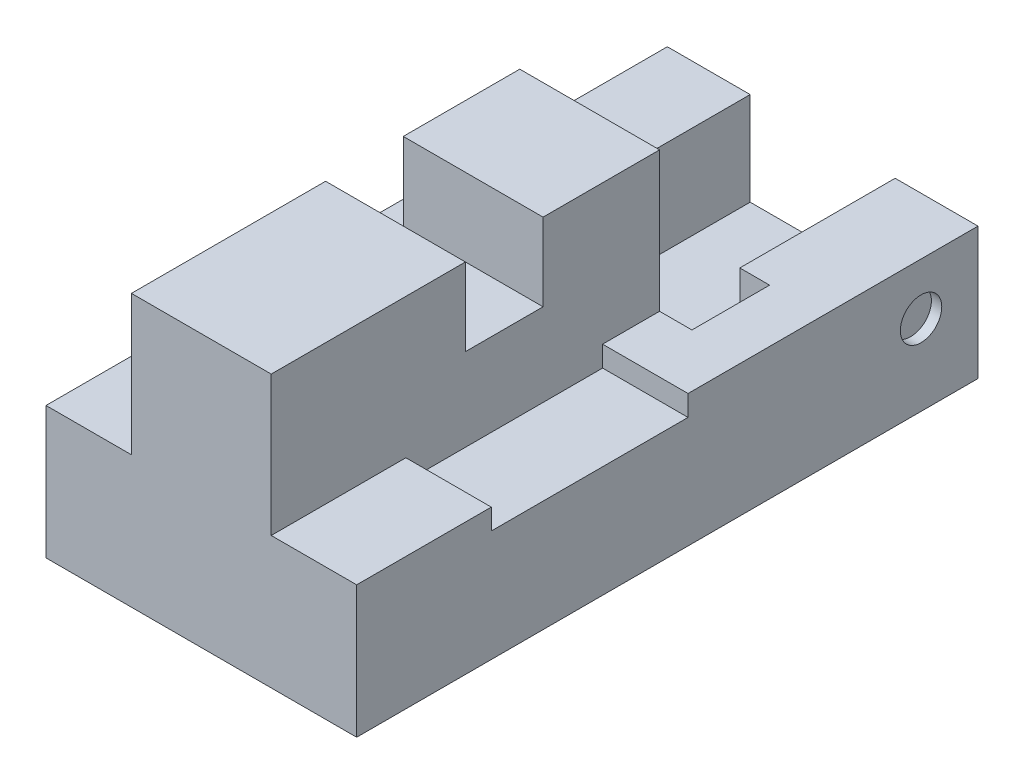
ISO-10303-21;
HEADER;
FILE_DESCRIPTION(('STEP AP214'),'2;1');
FILE_NAME('part.step','',(''),(''),'','','');
FILE_SCHEMA(('AUTOMOTIVE_DESIGN { 1 0 10303 214 1 1 1 1 }'));
ENDSEC;
DATA;
#1=APPLICATION_CONTEXT('core data for automotive mechanical design processes');
#2=APPLICATION_PROTOCOL_DEFINITION('international standard','automotive_design',2000,#1);
#3=PRODUCT_CONTEXT('',#1,'mechanical');
#4=PRODUCT('Part','Part','',(#3));
#5=PRODUCT_RELATED_PRODUCT_CATEGORY('part','',(#4));
#6=PRODUCT_DEFINITION_FORMATION('','',#4);
#7=PRODUCT_DEFINITION_CONTEXT('part definition',#1,'design');
#8=PRODUCT_DEFINITION('design','',#6,#7);
#9=PRODUCT_DEFINITION_SHAPE('','',#8);
#10=(LENGTH_UNIT() NAMED_UNIT(*) SI_UNIT(.MILLI.,.METRE.));
#11=(NAMED_UNIT(*) PLANE_ANGLE_UNIT() SI_UNIT($,.RADIAN.));
#12=(NAMED_UNIT(*) SI_UNIT($,.STERADIAN.) SOLID_ANGLE_UNIT());
#13=UNCERTAINTY_MEASURE_WITH_UNIT(LENGTH_MEASURE(1.E-05),#10,'distance_accuracy_value','');
#14=(GEOMETRIC_REPRESENTATION_CONTEXT(3) GLOBAL_UNCERTAINTY_ASSIGNED_CONTEXT((#13)) GLOBAL_UNIT_ASSIGNED_CONTEXT((#10,
#11,#12)) REPRESENTATION_CONTEXT('',''));
#15=CARTESIAN_POINT('',(0.,0.,0.));
#16=DIRECTION('',(0.,0.,1.));
#17=DIRECTION('',(1.,0.,0.));
#18=AXIS2_PLACEMENT_3D('',#15,#16,#17);
#19=CARTESIAN_POINT('',(0.,4.5,0.));
#20=DIRECTION('',(0.,1.,0.));
#21=DIRECTION('',(0.,0.,1.));
#22=AXIS2_PLACEMENT_3D('',#19,#20,#21);
#23=PLANE('',#22);
#24=DIRECTION('',(1.,0.,0.));
#25=VECTOR('',#24,1.);
#26=CARTESIAN_POINT('',(-1.35,4.5,5.25));
#27=LINE('',#26,#25);
#28=CARTESIAN_POINT('',(-1.35,4.5,5.25));
#29=VERTEX_POINT('',#28);
#30=CARTESIAN_POINT('',(1.35,4.5,5.25));
#31=VERTEX_POINT('',#30);
#32=EDGE_CURVE('E237',#29,#31,#27,.T.);
#33=ORIENTED_EDGE('',*,*,#32,.F.);
#34=DIRECTION('',(0.,0.,1.));
#35=VECTOR('',#34,1.);
#36=CARTESIAN_POINT('',(-1.35,4.5,2.6));
#37=LINE('',#36,#35);
#38=CARTESIAN_POINT('',(-1.35,4.5,9.));
#39=VERTEX_POINT('',#38);
#40=EDGE_CURVE('E271',#29,#39,#37,.T.);
#41=ORIENTED_EDGE('',*,*,#40,.T.);
#42=DIRECTION('',(1.,0.,0.));
#43=VECTOR('',#42,1.);
#44=CARTESIAN_POINT('',(-1.35,4.5,9.));
#45=LINE('',#44,#43);
#46=CARTESIAN_POINT('',(1.35,4.5,9.));
#47=VERTEX_POINT('',#46);
#48=EDGE_CURVE('E270',#39,#47,#45,.T.);
#49=ORIENTED_EDGE('',*,*,#48,.T.);
#50=DIRECTION('',(0.,0.,-1.));
#51=VECTOR('',#50,1.);
#52=CARTESIAN_POINT('',(1.35,4.5,6.4));
#53=LINE('',#52,#51);
#54=EDGE_CURVE('E274',#47,#31,#53,.T.);
#55=ORIENTED_EDGE('',*,*,#54,.T.);
#56=EDGE_LOOP('',(#33,#41,#49,#55));
#57=FACE_BOUND('',#56,.T.);
#58=ADVANCED_FACE('F44',(#57),#23,.T.);
#59=CARTESIAN_POINT('',(0.,1.8,0.));
#60=DIRECTION('',(0.,-1.,0.));
#61=DIRECTION('',(0.,0.,-1.));
#62=AXIS2_PLACEMENT_3D('',#59,#60,#61);
#63=PLANE('',#62);
#64=DIRECTION('',(0.,0.,1.));
#65=VECTOR('',#64,1.);
#66=CARTESIAN_POINT('',(-1.35,1.8,2.6));
#67=LINE('',#66,#65);
#68=CARTESIAN_POINT('',(-1.35,1.8,1.5));
#69=VERTEX_POINT('',#68);
#70=CARTESIAN_POINT('',(-1.35,1.8,2.6));
#71=VERTEX_POINT('',#70);
#72=EDGE_CURVE('E55',#69,#71,#67,.T.);
#73=ORIENTED_EDGE('',*,*,#72,.F.);
#74=DIRECTION('',(-1.,0.,0.));
#75=VECTOR('',#74,1.);
#76=CARTESIAN_POINT('',(-1.975,1.8,1.5));
#77=LINE('',#76,#75);
#78=CARTESIAN_POINT('',(-1.975,1.8,1.5));
#79=VERTEX_POINT('',#78);
#80=EDGE_CURVE('E396',#69,#79,#77,.T.);
#81=ORIENTED_EDGE('',*,*,#80,.T.);
#82=DIRECTION('',(0.,0.,-1.));
#83=VECTOR('',#82,1.);
#84=CARTESIAN_POINT('',(-1.975,1.8,0.));
#85=LINE('',#84,#83);
#86=CARTESIAN_POINT('',(-1.975,1.8,0.));
#87=VERTEX_POINT('',#86);
#88=EDGE_CURVE('E399',#79,#87,#85,.T.);
#89=ORIENTED_EDGE('',*,*,#88,.T.);
#90=DIRECTION('',(1.,0.,0.));
#91=VECTOR('',#90,1.);
#92=CARTESIAN_POINT('',(-1.4,1.8,0.));
#93=LINE('',#92,#91);
#94=CARTESIAN_POINT('',(-1.4,1.8,0.));
#95=VERTEX_POINT('',#94);
#96=EDGE_CURVE('E401',#87,#95,#93,.T.);
#97=ORIENTED_EDGE('',*,*,#96,.T.);
#98=DIRECTION('',(0.,0.,-1.));
#99=VECTOR('',#98,1.);
#100=CARTESIAN_POINT('',(-1.4,1.8,-3.));
#101=LINE('',#100,#99);
#102=CARTESIAN_POINT('',(-1.4,1.8,-3.));
#103=VERTEX_POINT('',#102);
#104=EDGE_CURVE('E403',#95,#103,#101,.T.);
#105=ORIENTED_EDGE('',*,*,#104,.T.);
#106=DIRECTION('',(-1.,0.,0.));
#107=VECTOR('',#106,1.);
#108=CARTESIAN_POINT('',(-3.,1.8,-3.));
#109=LINE('',#108,#107);
#110=CARTESIAN_POINT('',(-3.,1.8,-3.));
#111=VERTEX_POINT('',#110);
#112=EDGE_CURVE('E373',#103,#111,#109,.T.);
#113=ORIENTED_EDGE('',*,*,#112,.T.);
#114=DIRECTION('',(0.,0.,1.));
#115=VECTOR('',#114,1.);
#116=CARTESIAN_POINT('',(-3.,1.8,9.));
#117=LINE('',#116,#115);
#118=CARTESIAN_POINT('',(-3.,1.8,2.6));
#119=VERTEX_POINT('',#118);
#120=EDGE_CURVE('E378',#111,#119,#117,.T.);
#121=ORIENTED_EDGE('',*,*,#120,.T.);
#122=DIRECTION('',(-1.,0.,0.));
#123=VECTOR('',#122,1.);
#124=CARTESIAN_POINT('',(-1.35,1.8,2.6));
#125=LINE('',#124,#123);
#126=EDGE_CURVE('E319',#71,#119,#125,.T.);
#127=ORIENTED_EDGE('',*,*,#126,.F.);
#128=EDGE_LOOP('',(#73,#81,#89,#97,#105,#113,#121,#127));
#129=FACE_BOUND('',#128,.T.);
#130=ADVANCED_FACE('F528',(#129),#63,.F.);
#131=CARTESIAN_POINT('',(-1.35,1.8,6.4));
#132=VERTEX_POINT('',#131);
#133=CARTESIAN_POINT('',(-1.35,1.8,9.));
#134=VERTEX_POINT('',#133);
#135=EDGE_CURVE('E13',#132,#134,#67,.T.);
#136=ORIENTED_EDGE('',*,*,#135,.F.);
#137=DIRECTION('',(1.,0.,0.));
#138=VECTOR('',#137,1.);
#139=CARTESIAN_POINT('',(-1.35,1.8,6.4));
#140=LINE('',#139,#138);
#141=CARTESIAN_POINT('',(-3.,1.8,6.4));
#142=VERTEX_POINT('',#141);
#143=EDGE_CURVE('E310',#142,#132,#140,.T.);
#144=ORIENTED_EDGE('',*,*,#143,.F.);
#145=CARTESIAN_POINT('',(-3.,1.8,9.));
#146=VERTEX_POINT('',#145);
#147=EDGE_CURVE('E376',#142,#146,#117,.T.);
#148=ORIENTED_EDGE('',*,*,#147,.T.);
#149=DIRECTION('',(1.,0.,0.));
#150=VECTOR('',#149,1.);
#151=CARTESIAN_POINT('',(-3.,1.8,9.));
#152=LINE('',#151,#150);
#153=EDGE_CURVE('E382',#146,#134,#152,.T.);
#154=ORIENTED_EDGE('',*,*,#153,.T.);
#155=EDGE_LOOP('',(#136,#144,#148,#154));
#156=FACE_BOUND('',#155,.T.);
#157=ADVANCED_FACE('F544',(#156),#63,.F.);
#158=DIRECTION('',(0.,0.,-1.));
#159=VECTOR('',#158,1.);
#160=CARTESIAN_POINT('',(1.35,1.8,2.6));
#161=LINE('',#160,#159);
#162=CARTESIAN_POINT('',(1.35,1.8,9.));
#163=VERTEX_POINT('',#162);
#164=CARTESIAN_POINT('',(1.35,1.8,6.4));
#165=VERTEX_POINT('',#164);
#166=EDGE_CURVE('E266',#163,#165,#161,.T.);
#167=ORIENTED_EDGE('',*,*,#166,.F.);
#168=CARTESIAN_POINT('',(3.,1.8,9.));
#169=VERTEX_POINT('',#168);
#170=EDGE_CURVE('E381',#163,#169,#152,.T.);
#171=ORIENTED_EDGE('',*,*,#170,.T.);
#172=DIRECTION('',(0.,0.,-1.));
#173=VECTOR('',#172,1.);
#174=CARTESIAN_POINT('',(3.,1.8,-3.));
#175=LINE('',#174,#173);
#176=CARTESIAN_POINT('',(3.,1.8,6.4));
#177=VERTEX_POINT('',#176);
#178=EDGE_CURVE('E385',#169,#177,#175,.T.);
#179=ORIENTED_EDGE('',*,*,#178,.T.);
#180=DIRECTION('',(1.,0.,0.));
#181=VECTOR('',#180,1.);
#182=CARTESIAN_POINT('',(1.35,1.8,6.4));
#183=LINE('',#182,#181);
#184=EDGE_CURVE('E321',#165,#177,#183,.T.);
#185=ORIENTED_EDGE('',*,*,#184,.F.);
#186=EDGE_LOOP('',(#167,#171,#179,#185));
#187=FACE_BOUND('',#186,.T.);
#188=ADVANCED_FACE('F487',(#187),#63,.F.);
#189=CARTESIAN_POINT('',(1.35,1.8,2.6));
#190=VERTEX_POINT('',#189);
#191=CARTESIAN_POINT('',(1.35,1.8,1.5));
#192=VERTEX_POINT('',#191);
#193=EDGE_CURVE('E53',#190,#192,#161,.T.);
#194=ORIENTED_EDGE('',*,*,#193,.F.);
#195=DIRECTION('',(-1.,0.,0.));
#196=VECTOR('',#195,1.);
#197=CARTESIAN_POINT('',(1.35,1.8,2.6));
#198=LINE('',#197,#196);
#199=CARTESIAN_POINT('',(3.,1.8,2.6));
#200=VERTEX_POINT('',#199);
#201=EDGE_CURVE('E344',#200,#190,#198,.T.);
#202=ORIENTED_EDGE('',*,*,#201,.F.);
#203=CARTESIAN_POINT('',(3.,1.8,-3.));
#204=VERTEX_POINT('',#203);
#205=EDGE_CURVE('E384',#200,#204,#175,.T.);
#206=ORIENTED_EDGE('',*,*,#205,.T.);
#207=DIRECTION('',(-1.,0.,0.));
#208=VECTOR('',#207,1.);
#209=CARTESIAN_POINT('',(1.4,1.8,-3.));
#210=LINE('',#209,#208);
#211=CARTESIAN_POINT('',(1.4,1.8,-3.));
#212=VERTEX_POINT('',#211);
#213=EDGE_CURVE('E388',#204,#212,#210,.T.);
#214=ORIENTED_EDGE('',*,*,#213,.T.);
#215=DIRECTION('',(0.,0.,1.));
#216=VECTOR('',#215,1.);
#217=CARTESIAN_POINT('',(1.4,1.8,0.));
#218=LINE('',#217,#216);
#219=CARTESIAN_POINT('',(1.4,1.8,0.));
#220=VERTEX_POINT('',#219);
#221=EDGE_CURVE('E390',#212,#220,#218,.T.);
#222=ORIENTED_EDGE('',*,*,#221,.T.);
#223=DIRECTION('',(1.,0.,0.));
#224=VECTOR('',#223,1.);
#225=CARTESIAN_POINT('',(1.975,1.8,0.));
#226=LINE('',#225,#224);
#227=CARTESIAN_POINT('',(1.975,1.8,0.));
#228=VERTEX_POINT('',#227);
#229=EDGE_CURVE('E392',#220,#228,#226,.T.);
#230=ORIENTED_EDGE('',*,*,#229,.T.);
#231=DIRECTION('',(0.,0.,1.));
#232=VECTOR('',#231,1.);
#233=CARTESIAN_POINT('',(1.975,1.8,1.5));
#234=LINE('',#233,#232);
#235=CARTESIAN_POINT('',(1.975,1.8,1.5));
#236=VERTEX_POINT('',#235);
#237=EDGE_CURVE('E394',#228,#236,#234,.T.);
#238=ORIENTED_EDGE('',*,*,#237,.T.);
#239=EDGE_CURVE('E397',#236,#192,#77,.T.);
#240=ORIENTED_EDGE('',*,*,#239,.T.);
#241=EDGE_LOOP('',(#194,#202,#206,#214,#222,#230,#238,#240));
#242=FACE_BOUND('',#241,.T.);
#243=ADVANCED_FACE('F502',(#242),#63,.F.);
#244=CARTESIAN_POINT('',(-3.,1.8,9.));
#245=DIRECTION('',(1.,0.,0.));
#246=DIRECTION('',(0.,0.,-1.));
#247=AXIS2_PLACEMENT_3D('',#244,#245,#246);
#248=PLANE('',#247);
#249=CARTESIAN_POINT('',(-3.,0.8,-1.9));
#250=DIRECTION('',(1.,0.,0.));
#251=DIRECTION('',(0.,0.,-1.));
#252=AXIS2_PLACEMENT_3D('',#249,#250,#251);
#253=CIRCLE('',#252,0.4);
#254=CARTESIAN_POINT('',(-3.,0.8,-2.3));
#255=VERTEX_POINT('',#254);
#256=EDGE_CURVE('E293',#255,#255,#253,.T.);
#257=ORIENTED_EDGE('',*,*,#256,.T.);
#258=EDGE_LOOP('',(#257));
#259=FACE_BOUND('',#258,.T.);
#260=ORIENTED_EDGE('',*,*,#147,.F.);
#261=DIRECTION('',(0.,1.,0.));
#262=VECTOR('',#261,1.);
#263=CARTESIAN_POINT('',(-3.,1.4,6.4));
#264=LINE('',#263,#262);
#265=CARTESIAN_POINT('',(-3.,1.4,6.4));
#266=VERTEX_POINT('',#265);
#267=EDGE_CURVE('E328',#266,#142,#264,.T.);
#268=ORIENTED_EDGE('',*,*,#267,.F.);
#269=DIRECTION('',(0.,0.,1.));
#270=VECTOR('',#269,1.);
#271=CARTESIAN_POINT('',(-3.,1.4,2.6));
#272=LINE('',#271,#270);
#273=CARTESIAN_POINT('',(-3.,1.4,2.6));
#274=VERTEX_POINT('',#273);
#275=EDGE_CURVE('E313',#274,#266,#272,.T.);
#276=ORIENTED_EDGE('',*,*,#275,.F.);
#277=DIRECTION('',(0.,1.,0.));
#278=VECTOR('',#277,1.);
#279=CARTESIAN_POINT('',(-3.,1.4,2.6));
#280=LINE('',#279,#278);
#281=EDGE_CURVE('E330',#274,#119,#280,.T.);
#282=ORIENTED_EDGE('',*,*,#281,.T.);
#283=ORIENTED_EDGE('',*,*,#120,.F.);
#284=DIRECTION('',(0.,-1.,0.));
#285=VECTOR('',#284,1.);
#286=CARTESIAN_POINT('',(-3.,1.8,-3.));
#287=LINE('',#286,#285);
#288=CARTESIAN_POINT('',(-3.,-0.75,-3.));
#289=VERTEX_POINT('',#288);
#290=EDGE_CURVE('E48',#111,#289,#287,.T.);
#291=ORIENTED_EDGE('',*,*,#290,.T.);
#292=DIRECTION('',(0.,0.,-1.));
#293=VECTOR('',#292,1.);
#294=CARTESIAN_POINT('',(-3.,-0.75,-3.));
#295=LINE('',#294,#293);
#296=CARTESIAN_POINT('',(-3.,-0.75,9.));
#297=VERTEX_POINT('',#296);
#298=EDGE_CURVE('E358',#297,#289,#295,.T.);
#299=ORIENTED_EDGE('',*,*,#298,.F.);
#300=DIRECTION('',(0.,-1.,0.));
#301=VECTOR('',#300,1.);
#302=CARTESIAN_POINT('',(-3.,1.8,9.));
#303=LINE('',#302,#301);
#304=EDGE_CURVE('E451',#146,#297,#303,.T.);
#305=ORIENTED_EDGE('',*,*,#304,.F.);
#306=EDGE_LOOP('',(#260,#268,#276,#282,#283,#291,#299,#305));
#307=FACE_BOUND('',#306,.T.);
#308=ADVANCED_FACE('F46',(#259,#307),#248,.F.);
#309=CARTESIAN_POINT('',(-3.,1.8,9.));
#310=DIRECTION('',(0.,0.,-1.));
#311=DIRECTION('',(-1.,0.,0.));
#312=AXIS2_PLACEMENT_3D('',#309,#310,#311);
#313=PLANE('',#312);
#314=ORIENTED_EDGE('',*,*,#304,.T.);
#315=DIRECTION('',(-1.,0.,0.));
#316=VECTOR('',#315,1.);
#317=CARTESIAN_POINT('',(-3.,-0.75,9.));
#318=LINE('',#317,#316);
#319=CARTESIAN_POINT('',(3.,-0.75,9.));
#320=VERTEX_POINT('',#319);
#321=EDGE_CURVE('E367',#320,#297,#318,.T.);
#322=ORIENTED_EDGE('',*,*,#321,.F.);
#323=DIRECTION('',(0.,-1.,0.));
#324=VECTOR('',#323,1.);
#325=CARTESIAN_POINT('',(3.,1.8,9.));
#326=LINE('',#325,#324);
#327=EDGE_CURVE('E450',#169,#320,#326,.T.);
#328=ORIENTED_EDGE('',*,*,#327,.F.);
#329=ORIENTED_EDGE('',*,*,#170,.F.);
#330=DIRECTION('',(0.,-1.,0.));
#331=VECTOR('',#330,1.);
#332=CARTESIAN_POINT('',(1.35,4.5,9.));
#333=LINE('',#332,#331);
#334=EDGE_CURVE('E287',#47,#163,#333,.T.);
#335=ORIENTED_EDGE('',*,*,#334,.F.);
#336=ORIENTED_EDGE('',*,*,#48,.F.);
#337=DIRECTION('',(0.,-1.,0.));
#338=VECTOR('',#337,1.);
#339=CARTESIAN_POINT('',(-1.35,4.5,9.));
#340=LINE('',#339,#338);
#341=EDGE_CURVE('E290',#39,#134,#340,.T.);
#342=ORIENTED_EDGE('',*,*,#341,.T.);
#343=ORIENTED_EDGE('',*,*,#153,.F.);
#344=EDGE_LOOP('',(#314,#322,#328,#329,#335,#336,#342,#343));
#345=FACE_BOUND('',#344,.T.);
#346=ADVANCED_FACE('F483',(#345),#313,.F.);
#347=CARTESIAN_POINT('',(3.,1.8,-3.));
#348=DIRECTION('',(-1.,0.,0.));
#349=DIRECTION('',(0.,0.,1.));
#350=AXIS2_PLACEMENT_3D('',#347,#348,#349);
#351=PLANE('',#350);
#352=CARTESIAN_POINT('',(3.,0.8,-1.9));
#353=DIRECTION('',(1.,0.,0.));
#354=DIRECTION('',(0.,0.,-1.));
#355=AXIS2_PLACEMENT_3D('',#352,#353,#354);
#356=CIRCLE('',#355,0.4);
#357=CARTESIAN_POINT('',(3.,0.8,-2.3));
#358=VERTEX_POINT('',#357);
#359=EDGE_CURVE('E297',#358,#358,#356,.T.);
#360=ORIENTED_EDGE('',*,*,#359,.F.);
#361=EDGE_LOOP('',(#360));
#362=FACE_BOUND('',#361,.T.);
#363=ORIENTED_EDGE('',*,*,#205,.F.);
#364=DIRECTION('',(0.,1.,0.));
#365=VECTOR('',#364,1.);
#366=CARTESIAN_POINT('',(3.,1.4,2.6));
#367=LINE('',#366,#365);
#368=CARTESIAN_POINT('',(3.,1.4,2.6));
#369=VERTEX_POINT('',#368);
#370=EDGE_CURVE('E340',#369,#200,#367,.T.);
#371=ORIENTED_EDGE('',*,*,#370,.F.);
#372=DIRECTION('',(0.,0.,-1.));
#373=VECTOR('',#372,1.);
#374=CARTESIAN_POINT('',(3.,1.4,6.4));
#375=LINE('',#374,#373);
#376=CARTESIAN_POINT('',(3.,1.4,6.4));
#377=VERTEX_POINT('',#376);
#378=EDGE_CURVE('E351',#377,#369,#375,.T.);
#379=ORIENTED_EDGE('',*,*,#378,.F.);
#380=DIRECTION('',(0.,1.,0.));
#381=VECTOR('',#380,1.);
#382=CARTESIAN_POINT('',(3.,1.4,6.4));
#383=LINE('',#382,#381);
#384=EDGE_CURVE('E337',#377,#177,#383,.T.);
#385=ORIENTED_EDGE('',*,*,#384,.T.);
#386=ORIENTED_EDGE('',*,*,#178,.F.);
#387=ORIENTED_EDGE('',*,*,#327,.T.);
#388=DIRECTION('',(0.,0.,1.));
#389=VECTOR('',#388,1.);
#390=CARTESIAN_POINT('',(3.,-0.75,9.));
#391=LINE('',#390,#389);
#392=CARTESIAN_POINT('',(3.,-0.75,-3.));
#393=VERTEX_POINT('',#392);
#394=EDGE_CURVE('E364',#393,#320,#391,.T.);
#395=ORIENTED_EDGE('',*,*,#394,.F.);
#396=DIRECTION('',(0.,-1.,0.));
#397=VECTOR('',#396,1.);
#398=CARTESIAN_POINT('',(3.,1.8,-3.));
#399=LINE('',#398,#397);
#400=EDGE_CURVE('E448',#204,#393,#399,.T.);
#401=ORIENTED_EDGE('',*,*,#400,.F.);
#402=EDGE_LOOP('',(#363,#371,#379,#385,#386,#387,#395,#401));
#403=FACE_BOUND('',#402,.T.);
#404=ADVANCED_FACE('F495',(#362,#403),#351,.F.);
#405=CARTESIAN_POINT('',(1.4,1.8,-3.));
#406=DIRECTION('',(0.,0.,1.));
#407=DIRECTION('',(1.,0.,0.));
#408=AXIS2_PLACEMENT_3D('',#405,#406,#407);
#409=PLANE('',#408);
#410=ORIENTED_EDGE('',*,*,#400,.T.);
#411=DIRECTION('',(1.,0.,0.));
#412=VECTOR('',#411,1.);
#413=CARTESIAN_POINT('',(-3.,-0.75,-3.));
#414=LINE('',#413,#412);
#415=EDGE_CURVE('E361',#289,#393,#414,.T.);
#416=ORIENTED_EDGE('',*,*,#415,.F.);
#417=ORIENTED_EDGE('',*,*,#290,.F.);
#418=ORIENTED_EDGE('',*,*,#112,.F.);
#419=DIRECTION('',(0.,-1.,0.));
#420=VECTOR('',#419,1.);
#421=CARTESIAN_POINT('',(-1.4,1.8,-3.));
#422=LINE('',#421,#420);
#423=CARTESIAN_POINT('',(-1.4,0.,-3.));
#424=VERTEX_POINT('',#423);
#425=EDGE_CURVE('E405',#103,#424,#422,.T.);
#426=ORIENTED_EDGE('',*,*,#425,.T.);
#427=DIRECTION('',(1.,0.,0.));
#428=VECTOR('',#427,1.);
#429=CARTESIAN_POINT('',(-3.,0.,-3.));
#430=LINE('',#429,#428);
#431=CARTESIAN_POINT('',(1.4,0.,-3.));
#432=VERTEX_POINT('',#431);
#433=EDGE_CURVE('E327',#424,#432,#430,.T.);
#434=ORIENTED_EDGE('',*,*,#433,.T.);
#435=DIRECTION('',(0.,-1.,0.));
#436=VECTOR('',#435,1.);
#437=CARTESIAN_POINT('',(1.4,1.8,-3.));
#438=LINE('',#437,#436);
#439=EDGE_CURVE('E445',#212,#432,#438,.T.);
#440=ORIENTED_EDGE('',*,*,#439,.F.);
#441=ORIENTED_EDGE('',*,*,#213,.F.);
#442=EDGE_LOOP('',(#410,#416,#417,#418,#426,#434,#440,#441));
#443=FACE_BOUND('',#442,.T.);
#444=ADVANCED_FACE('F508',(#443),#409,.F.);
#445=CARTESIAN_POINT('',(1.4,1.8,0.));
#446=DIRECTION('',(1.,0.,0.));
#447=DIRECTION('',(0.,0.,-1.));
#448=AXIS2_PLACEMENT_3D('',#445,#446,#447);
#449=PLANE('',#448);
#450=DIRECTION('',(0.,0.,1.));
#451=VECTOR('',#450,1.);
#452=CARTESIAN_POINT('',(1.4,0.,0.));
#453=LINE('',#452,#451);
#454=CARTESIAN_POINT('',(1.4,0.,0.));
#455=VERTEX_POINT('',#454);
#456=EDGE_CURVE('E370',#432,#455,#453,.T.);
#457=ORIENTED_EDGE('',*,*,#456,.T.);
#458=DIRECTION('',(0.,-1.,0.));
#459=VECTOR('',#458,1.);
#460=CARTESIAN_POINT('',(1.4,1.8,0.));
#461=LINE('',#460,#459);
#462=EDGE_CURVE('E442',#220,#455,#461,.T.);
#463=ORIENTED_EDGE('',*,*,#462,.F.);
#464=ORIENTED_EDGE('',*,*,#221,.F.);
#465=ORIENTED_EDGE('',*,*,#439,.T.);
#466=EDGE_LOOP('',(#457,#463,#464,#465));
#467=FACE_BOUND('',#466,.T.);
#468=ADVANCED_FACE('F514',(#467),#449,.F.);
#469=CARTESIAN_POINT('',(1.975,1.8,0.));
#470=DIRECTION('',(0.,0.,-1.));
#471=DIRECTION('',(-1.,0.,0.));
#472=AXIS2_PLACEMENT_3D('',#469,#470,#471);
#473=PLANE('',#472);
#474=DIRECTION('',(1.,0.,0.));
#475=VECTOR('',#474,1.);
#476=CARTESIAN_POINT('',(1.975,0.,0.));
#477=LINE('',#476,#475);
#478=CARTESIAN_POINT('',(1.975,0.,0.));
#479=VERTEX_POINT('',#478);
#480=EDGE_CURVE('E408',#455,#479,#477,.T.);
#481=ORIENTED_EDGE('',*,*,#480,.T.);
#482=DIRECTION('',(0.,-1.,0.));
#483=VECTOR('',#482,1.);
#484=CARTESIAN_POINT('',(1.975,1.8,0.));
#485=LINE('',#484,#483);
#486=EDGE_CURVE('E439',#228,#479,#485,.T.);
#487=ORIENTED_EDGE('',*,*,#486,.F.);
#488=ORIENTED_EDGE('',*,*,#229,.F.);
#489=ORIENTED_EDGE('',*,*,#462,.T.);
#490=EDGE_LOOP('',(#481,#487,#488,#489));
#491=FACE_BOUND('',#490,.T.);
#492=ADVANCED_FACE('F516',(#491),#473,.F.);
#493=CARTESIAN_POINT('',(1.975,1.8,1.5));
#494=DIRECTION('',(1.,0.,0.));
#495=DIRECTION('',(0.,0.,-1.));
#496=AXIS2_PLACEMENT_3D('',#493,#494,#495);
#497=PLANE('',#496);
#498=DIRECTION('',(0.,0.,1.));
#499=VECTOR('',#498,1.);
#500=CARTESIAN_POINT('',(1.975,0.,1.5));
#501=LINE('',#500,#499);
#502=CARTESIAN_POINT('',(1.975,0.,1.5));
#503=VERTEX_POINT('',#502);
#504=EDGE_CURVE('E411',#479,#503,#501,.T.);
#505=ORIENTED_EDGE('',*,*,#504,.T.);
#506=DIRECTION('',(0.,-1.,0.));
#507=VECTOR('',#506,1.);
#508=CARTESIAN_POINT('',(1.975,1.8,1.5));
#509=LINE('',#508,#507);
#510=EDGE_CURVE('E436',#236,#503,#509,.T.);
#511=ORIENTED_EDGE('',*,*,#510,.F.);
#512=ORIENTED_EDGE('',*,*,#237,.F.);
#513=ORIENTED_EDGE('',*,*,#486,.T.);
#514=EDGE_LOOP('',(#505,#511,#512,#513));
#515=FACE_BOUND('',#514,.T.);
#516=ADVANCED_FACE('F520',(#515),#497,.F.);
#517=CARTESIAN_POINT('',(-1.975,1.8,1.5));
#518=DIRECTION('',(0.,0.,1.));
#519=DIRECTION('',(1.,0.,0.));
#520=AXIS2_PLACEMENT_3D('',#517,#518,#519);
#521=PLANE('',#520);
#522=DIRECTION('',(-1.,0.,0.));
#523=VECTOR('',#522,1.);
#524=CARTESIAN_POINT('',(-1.975,0.,1.5));
#525=LINE('',#524,#523);
#526=CARTESIAN_POINT('',(-1.975,0.,1.5));
#527=VERTEX_POINT('',#526);
#528=EDGE_CURVE('E414',#503,#527,#525,.T.);
#529=ORIENTED_EDGE('',*,*,#528,.T.);
#530=DIRECTION('',(0.,-1.,0.));
#531=VECTOR('',#530,1.);
#532=CARTESIAN_POINT('',(-1.975,1.8,1.5));
#533=LINE('',#532,#531);
#534=EDGE_CURVE('E433',#79,#527,#533,.T.);
#535=ORIENTED_EDGE('',*,*,#534,.F.);
#536=ORIENTED_EDGE('',*,*,#80,.F.);
#537=DIRECTION('',(0.,-1.,0.));
#538=VECTOR('',#537,1.);
#539=CARTESIAN_POINT('',(-1.35,4.5,1.5));
#540=LINE('',#539,#538);
#541=CARTESIAN_POINT('',(-1.35,4.5,1.5));
#542=VERTEX_POINT('',#541);
#543=EDGE_CURVE('E279',#542,#69,#540,.T.);
#544=ORIENTED_EDGE('',*,*,#543,.F.);
#545=DIRECTION('',(-1.,0.,0.));
#546=VECTOR('',#545,1.);
#547=CARTESIAN_POINT('',(1.35,4.5,1.5));
#548=LINE('',#547,#546);
#549=CARTESIAN_POINT('',(1.35,4.5,1.5));
#550=VERTEX_POINT('',#549);
#551=EDGE_CURVE('E276',#550,#542,#548,.T.);
#552=ORIENTED_EDGE('',*,*,#551,.F.);
#553=DIRECTION('',(0.,-1.,0.));
#554=VECTOR('',#553,1.);
#555=CARTESIAN_POINT('',(1.35,4.5,1.5));
#556=LINE('',#555,#554);
#557=EDGE_CURVE('E284',#550,#192,#556,.T.);
#558=ORIENTED_EDGE('',*,*,#557,.T.);
#559=ORIENTED_EDGE('',*,*,#239,.F.);
#560=ORIENTED_EDGE('',*,*,#510,.T.);
#561=EDGE_LOOP('',(#529,#535,#536,#544,#552,#558,#559,#560));
#562=FACE_BOUND('',#561,.T.);
#563=ADVANCED_FACE('F468',(#562),#521,.F.);
#564=CARTESIAN_POINT('',(-1.975,1.8,0.));
#565=DIRECTION('',(-1.,0.,0.));
#566=DIRECTION('',(0.,0.,1.));
#567=AXIS2_PLACEMENT_3D('',#564,#565,#566);
#568=PLANE('',#567);
#569=DIRECTION('',(0.,0.,-1.));
#570=VECTOR('',#569,1.);
#571=CARTESIAN_POINT('',(-1.975,0.,0.));
#572=LINE('',#571,#570);
#573=CARTESIAN_POINT('',(-1.975,0.,0.));
#574=VERTEX_POINT('',#573);
#575=EDGE_CURVE('E417',#527,#574,#572,.T.);
#576=ORIENTED_EDGE('',*,*,#575,.T.);
#577=DIRECTION('',(0.,-1.,0.));
#578=VECTOR('',#577,1.);
#579=CARTESIAN_POINT('',(-1.975,1.8,0.));
#580=LINE('',#579,#578);
#581=EDGE_CURVE('E430',#87,#574,#580,.T.);
#582=ORIENTED_EDGE('',*,*,#581,.F.);
#583=ORIENTED_EDGE('',*,*,#88,.F.);
#584=ORIENTED_EDGE('',*,*,#534,.T.);
#585=EDGE_LOOP('',(#576,#582,#583,#584));
#586=FACE_BOUND('',#585,.T.);
#587=ADVANCED_FACE('F525',(#586),#568,.F.);
#588=CARTESIAN_POINT('',(-1.4,1.8,0.));
#589=DIRECTION('',(0.,0.,-1.));
#590=DIRECTION('',(-1.,0.,0.));
#591=AXIS2_PLACEMENT_3D('',#588,#589,#590);
#592=PLANE('',#591);
#593=DIRECTION('',(1.,0.,0.));
#594=VECTOR('',#593,1.);
#595=CARTESIAN_POINT('',(-1.4,0.,0.));
#596=LINE('',#595,#594);
#597=CARTESIAN_POINT('',(-1.4,0.,0.));
#598=VERTEX_POINT('',#597);
#599=EDGE_CURVE('E420',#574,#598,#596,.T.);
#600=ORIENTED_EDGE('',*,*,#599,.T.);
#601=DIRECTION('',(0.,-1.,0.));
#602=VECTOR('',#601,1.);
#603=CARTESIAN_POINT('',(-1.4,1.8,0.));
#604=LINE('',#603,#602);
#605=EDGE_CURVE('E427',#95,#598,#604,.T.);
#606=ORIENTED_EDGE('',*,*,#605,.F.);
#607=ORIENTED_EDGE('',*,*,#96,.F.);
#608=ORIENTED_EDGE('',*,*,#581,.T.);
#609=EDGE_LOOP('',(#600,#606,#607,#608));
#610=FACE_BOUND('',#609,.T.);
#611=ADVANCED_FACE('F607',(#610),#592,.F.);
#612=CARTESIAN_POINT('',(-1.4,1.8,-3.));
#613=DIRECTION('',(-1.,0.,0.));
#614=DIRECTION('',(0.,0.,1.));
#615=AXIS2_PLACEMENT_3D('',#612,#613,#614);
#616=PLANE('',#615);
#617=DIRECTION('',(0.,0.,-1.));
#618=VECTOR('',#617,1.);
#619=CARTESIAN_POINT('',(-1.4,0.,-3.));
#620=LINE('',#619,#618);
#621=EDGE_CURVE('E377',#598,#424,#620,.T.);
#622=ORIENTED_EDGE('',*,*,#621,.T.);
#623=ORIENTED_EDGE('',*,*,#425,.F.);
#624=ORIENTED_EDGE('',*,*,#104,.F.);
#625=ORIENTED_EDGE('',*,*,#605,.T.);
#626=EDGE_LOOP('',(#622,#623,#624,#625));
#627=FACE_BOUND('',#626,.T.);
#628=ADVANCED_FACE('F603',(#627),#616,.F.);
#629=CARTESIAN_POINT('',(0.,0.,0.));
#630=DIRECTION('',(0.,1.,0.));
#631=DIRECTION('',(0.,0.,1.));
#632=AXIS2_PLACEMENT_3D('',#629,#630,#631);
#633=PLANE('',#632);
#634=ORIENTED_EDGE('',*,*,#621,.F.);
#635=ORIENTED_EDGE('',*,*,#599,.F.);
#636=ORIENTED_EDGE('',*,*,#575,.F.);
#637=ORIENTED_EDGE('',*,*,#528,.F.);
#638=ORIENTED_EDGE('',*,*,#504,.F.);
#639=ORIENTED_EDGE('',*,*,#480,.F.);
#640=ORIENTED_EDGE('',*,*,#456,.F.);
#641=ORIENTED_EDGE('',*,*,#433,.F.);
#642=EDGE_LOOP('',(#634,#635,#636,#637,#638,#639,#640,#641));
#643=FACE_BOUND('',#642,.T.);
#644=ADVANCED_FACE('F600',(#643),#633,.T.);
#645=CARTESIAN_POINT('',(0.,-0.75,0.));
#646=DIRECTION('',(0.,1.,0.));
#647=DIRECTION('',(0.,0.,1.));
#648=AXIS2_PLACEMENT_3D('',#645,#646,#647);
#649=PLANE('',#648);
#650=ORIENTED_EDGE('',*,*,#298,.T.);
#651=ORIENTED_EDGE('',*,*,#415,.T.);
#652=ORIENTED_EDGE('',*,*,#394,.T.);
#653=ORIENTED_EDGE('',*,*,#321,.T.);
#654=EDGE_LOOP('',(#650,#651,#652,#653));
#655=FACE_BOUND('',#654,.T.);
#656=ADVANCED_FACE('F592',(#655),#649,.F.);
#657=CARTESIAN_POINT('',(1.35,1.4,6.4));
#658=DIRECTION('',(-1.,0.,0.));
#659=DIRECTION('',(0.,0.,1.));
#660=AXIS2_PLACEMENT_3D('',#657,#658,#659);
#661=PLANE('',#660);
#662=DIRECTION('',(0.,0.,-1.));
#663=VECTOR('',#662,1.);
#664=CARTESIAN_POINT('',(1.35,3.,3.75));
#665=LINE('',#664,#663);
#666=CARTESIAN_POINT('',(1.35,3.,5.25));
#667=VERTEX_POINT('',#666);
#668=CARTESIAN_POINT('',(1.35,3.,3.75));
#669=VERTEX_POINT('',#668);
#670=EDGE_CURVE('E242',#667,#669,#665,.T.);
#671=ORIENTED_EDGE('',*,*,#670,.F.);
#672=DIRECTION('',(0.,1.,0.));
#673=VECTOR('',#672,1.);
#674=CARTESIAN_POINT('',(1.35,-1.6886890422961,5.25));
#675=LINE('',#674,#673);
#676=EDGE_CURVE('E231',#667,#31,#675,.T.);
#677=ORIENTED_EDGE('',*,*,#676,.T.);
#678=ORIENTED_EDGE('',*,*,#54,.F.);
#679=ORIENTED_EDGE('',*,*,#334,.T.);
#680=ORIENTED_EDGE('',*,*,#166,.T.);
#681=DIRECTION('',(0.,1.,0.));
#682=VECTOR('',#681,1.);
#683=CARTESIAN_POINT('',(1.35,1.4,6.4));
#684=LINE('',#683,#682);
#685=CARTESIAN_POINT('',(1.35,1.4,6.4));
#686=VERTEX_POINT('',#685);
#687=EDGE_CURVE('E334',#686,#165,#684,.T.);
#688=ORIENTED_EDGE('',*,*,#687,.F.);
#689=DIRECTION('',(0.,0.,1.));
#690=VECTOR('',#689,1.);
#691=CARTESIAN_POINT('',(1.35,1.4,6.4));
#692=LINE('',#691,#690);
#693=CARTESIAN_POINT('',(1.35,1.4,2.6));
#694=VERTEX_POINT('',#693);
#695=EDGE_CURVE('E347',#694,#686,#692,.T.);
#696=ORIENTED_EDGE('',*,*,#695,.F.);
#697=DIRECTION('',(0.,1.,0.));
#698=VECTOR('',#697,1.);
#699=CARTESIAN_POINT('',(1.35,1.4,2.6));
#700=LINE('',#699,#698);
#701=EDGE_CURVE('E303',#694,#190,#700,.T.);
#702=ORIENTED_EDGE('',*,*,#701,.T.);
#703=ORIENTED_EDGE('',*,*,#193,.T.);
#704=ORIENTED_EDGE('',*,*,#557,.F.);
#705=CARTESIAN_POINT('',(1.35,4.5,3.75));
#706=VERTEX_POINT('',#705);
#707=EDGE_CURVE('E273',#706,#550,#53,.T.);
#708=ORIENTED_EDGE('',*,*,#707,.F.);
#709=DIRECTION('',(0.,1.,0.));
#710=VECTOR('',#709,1.);
#711=CARTESIAN_POINT('',(1.35,-1.6886890422961,3.75));
#712=LINE('',#711,#710);
#713=EDGE_CURVE('E62',#669,#706,#712,.T.);
#714=ORIENTED_EDGE('',*,*,#713,.F.);
#715=EDGE_LOOP('',(#671,#677,#678,#679,#680,#688,#696,#702,#703,#704,#708,#714));
#716=FACE_BOUND('',#715,.T.);
#717=ADVANCED_FACE('F253',(#716),#661,.F.);
#718=CARTESIAN_POINT('',(1.35,1.4,2.6));
#719=DIRECTION('',(0.,0.,-1.));
#720=DIRECTION('',(-1.,0.,0.));
#721=AXIS2_PLACEMENT_3D('',#718,#719,#720);
#722=PLANE('',#721);
#723=ORIENTED_EDGE('',*,*,#201,.T.);
#724=ORIENTED_EDGE('',*,*,#701,.F.);
#725=DIRECTION('',(-1.,0.,0.));
#726=VECTOR('',#725,1.);
#727=CARTESIAN_POINT('',(1.35,1.4,2.6));
#728=LINE('',#727,#726);
#729=EDGE_CURVE('E336',#369,#694,#728,.T.);
#730=ORIENTED_EDGE('',*,*,#729,.F.);
#731=ORIENTED_EDGE('',*,*,#370,.T.);
#732=EDGE_LOOP('',(#723,#724,#730,#731));
#733=FACE_BOUND('',#732,.T.);
#734=ADVANCED_FACE('F501',(#733),#722,.F.);
#735=CARTESIAN_POINT('',(1.35,1.4,6.4));
#736=DIRECTION('',(0.,0.,1.));
#737=DIRECTION('',(1.,0.,0.));
#738=AXIS2_PLACEMENT_3D('',#735,#736,#737);
#739=PLANE('',#738);
#740=ORIENTED_EDGE('',*,*,#184,.T.);
#741=ORIENTED_EDGE('',*,*,#384,.F.);
#742=DIRECTION('',(1.,0.,0.));
#743=VECTOR('',#742,1.);
#744=CARTESIAN_POINT('',(1.35,1.4,6.4));
#745=LINE('',#744,#743);
#746=EDGE_CURVE('E353',#686,#377,#745,.T.);
#747=ORIENTED_EDGE('',*,*,#746,.F.);
#748=ORIENTED_EDGE('',*,*,#687,.T.);
#749=EDGE_LOOP('',(#740,#741,#747,#748));
#750=FACE_BOUND('',#749,.T.);
#751=ADVANCED_FACE('F490',(#750),#739,.F.);
#752=CARTESIAN_POINT('',(0.,1.4,0.));
#753=DIRECTION('',(0.,-1.,0.));
#754=DIRECTION('',(0.,0.,-1.));
#755=AXIS2_PLACEMENT_3D('',#752,#753,#754);
#756=PLANE('',#755);
#757=ORIENTED_EDGE('',*,*,#695,.T.);
#758=ORIENTED_EDGE('',*,*,#746,.T.);
#759=ORIENTED_EDGE('',*,*,#378,.T.);
#760=ORIENTED_EDGE('',*,*,#729,.T.);
#761=EDGE_LOOP('',(#757,#758,#759,#760));
#762=FACE_BOUND('',#761,.T.);
#763=ADVANCED_FACE('F499',(#762),#756,.F.);
#764=CARTESIAN_POINT('',(-1.35,1.4,2.6));
#765=DIRECTION('',(1.,0.,0.));
#766=DIRECTION('',(0.,0.,-1.));
#767=AXIS2_PLACEMENT_3D('',#764,#765,#766);
#768=PLANE('',#767);
#769=ORIENTED_EDGE('',*,*,#40,.F.);
#770=DIRECTION('',(0.,1.,0.));
#771=VECTOR('',#770,1.);
#772=CARTESIAN_POINT('',(-1.35,-1.6886890422961,5.25));
#773=LINE('',#772,#771);
#774=CARTESIAN_POINT('',(-1.35,3.,5.25));
#775=VERTEX_POINT('',#774);
#776=EDGE_CURVE('E264',#775,#29,#773,.T.);
#777=ORIENTED_EDGE('',*,*,#776,.F.);
#778=DIRECTION('',(0.,0.,1.));
#779=VECTOR('',#778,1.);
#780=CARTESIAN_POINT('',(-1.35,3.,3.75));
#781=LINE('',#780,#779);
#782=CARTESIAN_POINT('',(-1.35,3.,3.75));
#783=VERTEX_POINT('',#782);
#784=EDGE_CURVE('E249',#783,#775,#781,.T.);
#785=ORIENTED_EDGE('',*,*,#784,.F.);
#786=DIRECTION('',(0.,1.,0.));
#787=VECTOR('',#786,1.);
#788=CARTESIAN_POINT('',(-1.35,-1.6886890422961,3.75));
#789=LINE('',#788,#787);
#790=CARTESIAN_POINT('',(-1.35,4.5,3.75));
#791=VERTEX_POINT('',#790);
#792=EDGE_CURVE('E261',#783,#791,#789,.T.);
#793=ORIENTED_EDGE('',*,*,#792,.T.);
#794=EDGE_CURVE('E267',#542,#791,#37,.T.);
#795=ORIENTED_EDGE('',*,*,#794,.F.);
#796=ORIENTED_EDGE('',*,*,#543,.T.);
#797=ORIENTED_EDGE('',*,*,#72,.T.);
#798=DIRECTION('',(0.,1.,0.));
#799=VECTOR('',#798,1.);
#800=CARTESIAN_POINT('',(-1.35,1.4,2.6));
#801=LINE('',#800,#799);
#802=CARTESIAN_POINT('',(-1.35,1.4,2.6));
#803=VERTEX_POINT('',#802);
#804=EDGE_CURVE('E318',#803,#71,#801,.T.);
#805=ORIENTED_EDGE('',*,*,#804,.F.);
#806=DIRECTION('',(0.,0.,-1.));
#807=VECTOR('',#806,1.);
#808=CARTESIAN_POINT('',(-1.35,1.4,2.6));
#809=LINE('',#808,#807);
#810=CARTESIAN_POINT('',(-1.35,1.4,6.4));
#811=VERTEX_POINT('',#810);
#812=EDGE_CURVE('E306',#811,#803,#809,.T.);
#813=ORIENTED_EDGE('',*,*,#812,.F.);
#814=DIRECTION('',(0.,1.,0.));
#815=VECTOR('',#814,1.);
#816=CARTESIAN_POINT('',(-1.35,1.4,6.4));
#817=LINE('',#816,#815);
#818=EDGE_CURVE('E324',#811,#132,#817,.T.);
#819=ORIENTED_EDGE('',*,*,#818,.T.);
#820=ORIENTED_EDGE('',*,*,#135,.T.);
#821=ORIENTED_EDGE('',*,*,#341,.F.);
#822=EDGE_LOOP('',(#769,#777,#785,#793,#795,#796,#797,#805,#813,#819,#820,#821));
#823=FACE_BOUND('',#822,.T.);
#824=ADVANCED_FACE('F477',(#823),#768,.F.);
#825=CARTESIAN_POINT('',(-1.35,1.4,6.4));
#826=DIRECTION('',(0.,0.,1.));
#827=DIRECTION('',(1.,0.,0.));
#828=AXIS2_PLACEMENT_3D('',#825,#826,#827);
#829=PLANE('',#828);
#830=ORIENTED_EDGE('',*,*,#143,.T.);
#831=ORIENTED_EDGE('',*,*,#818,.F.);
#832=DIRECTION('',(1.,0.,0.));
#833=VECTOR('',#832,1.);
#834=CARTESIAN_POINT('',(-1.35,1.4,6.4));
#835=LINE('',#834,#833);
#836=EDGE_CURVE('E315',#266,#811,#835,.T.);
#837=ORIENTED_EDGE('',*,*,#836,.F.);
#838=ORIENTED_EDGE('',*,*,#267,.T.);
#839=EDGE_LOOP('',(#830,#831,#837,#838));
#840=FACE_BOUND('',#839,.T.);
#841=ADVANCED_FACE('F540',(#840),#829,.F.);
#842=CARTESIAN_POINT('',(-1.35,1.4,2.6));
#843=DIRECTION('',(0.,0.,-1.));
#844=DIRECTION('',(-1.,0.,0.));
#845=AXIS2_PLACEMENT_3D('',#842,#843,#844);
#846=PLANE('',#845);
#847=ORIENTED_EDGE('',*,*,#126,.T.);
#848=ORIENTED_EDGE('',*,*,#281,.F.);
#849=DIRECTION('',(-1.,0.,0.));
#850=VECTOR('',#849,1.);
#851=CARTESIAN_POINT('',(-1.35,1.4,2.6));
#852=LINE('',#851,#850);
#853=EDGE_CURVE('E309',#803,#274,#852,.T.);
#854=ORIENTED_EDGE('',*,*,#853,.F.);
#855=ORIENTED_EDGE('',*,*,#804,.T.);
#856=EDGE_LOOP('',(#847,#848,#854,#855));
#857=FACE_BOUND('',#856,.T.);
#858=ADVANCED_FACE('F533',(#857),#846,.F.);
#859=CARTESIAN_POINT('',(0.,1.4,0.));
#860=DIRECTION('',(0.,-1.,0.));
#861=DIRECTION('',(0.,0.,-1.));
#862=AXIS2_PLACEMENT_3D('',#859,#860,#861);
#863=PLANE('',#862);
#864=ORIENTED_EDGE('',*,*,#812,.T.);
#865=ORIENTED_EDGE('',*,*,#853,.T.);
#866=ORIENTED_EDGE('',*,*,#275,.T.);
#867=ORIENTED_EDGE('',*,*,#836,.T.);
#868=EDGE_LOOP('',(#864,#865,#866,#867));
#869=FACE_BOUND('',#868,.T.);
#870=ADVANCED_FACE('F536',(#869),#863,.F.);
#871=CARTESIAN_POINT('',(2.8,0.8,-1.9));
#872=DIRECTION('',(1.,0.,0.));
#873=DIRECTION('',(0.,0.,-1.));
#874=AXIS2_PLACEMENT_3D('',#871,#872,#873);
#875=CYLINDRICAL_SURFACE('',#874,0.4);
#876=CARTESIAN_POINT('',(2.8,0.8,-1.9));
#877=DIRECTION('',(1.,0.,0.));
#878=DIRECTION('',(0.,0.,-1.));
#879=AXIS2_PLACEMENT_3D('',#876,#877,#878);
#880=CIRCLE('',#879,0.4);
#881=CARTESIAN_POINT('',(2.8,0.8,-2.3));
#882=VERTEX_POINT('',#881);
#883=EDGE_CURVE('E300',#882,#882,#880,.T.);
#884=ORIENTED_EDGE('',*,*,#883,.F.);
#885=EDGE_LOOP('',(#884));
#886=FACE_BOUND('',#885,.T.);
#887=ORIENTED_EDGE('',*,*,#359,.T.);
#888=EDGE_LOOP('',(#887));
#889=FACE_BOUND('',#888,.T.);
#890=ADVANCED_FACE('F577',(#886,#889),#875,.F.);
#891=CARTESIAN_POINT('',(2.8,0.8,-1.9));
#892=DIRECTION('',(1.,0.,0.));
#893=DIRECTION('',(0.,0.,-1.));
#894=AXIS2_PLACEMENT_3D('',#891,#892,#893);
#895=PLANE('',#894);
#896=ORIENTED_EDGE('',*,*,#883,.T.);
#897=EDGE_LOOP('',(#896));
#898=FACE_BOUND('',#897,.T.);
#899=ADVANCED_FACE('F570',(#898),#895,.T.);
#900=CARTESIAN_POINT('',(-2.8,0.8,-1.9));
#901=DIRECTION('',(-1.,0.,0.));
#902=DIRECTION('',(0.,0.,1.));
#903=AXIS2_PLACEMENT_3D('',#900,#901,#902);
#904=CYLINDRICAL_SURFACE('',#903,0.4);
#905=CARTESIAN_POINT('',(-2.8,0.8,-1.9));
#906=DIRECTION('',(1.,0.,0.));
#907=DIRECTION('',(0.,0.,-1.));
#908=AXIS2_PLACEMENT_3D('',#905,#906,#907);
#909=CIRCLE('',#908,0.4);
#910=CARTESIAN_POINT('',(-2.8,0.8,-2.3));
#911=VERTEX_POINT('',#910);
#912=EDGE_CURVE('E294',#911,#911,#909,.T.);
#913=ORIENTED_EDGE('',*,*,#912,.T.);
#914=EDGE_LOOP('',(#913));
#915=FACE_BOUND('',#914,.T.);
#916=ORIENTED_EDGE('',*,*,#256,.F.);
#917=EDGE_LOOP('',(#916));
#918=FACE_BOUND('',#917,.T.);
#919=ADVANCED_FACE('F565',(#915,#918),#904,.F.);
#920=CARTESIAN_POINT('',(-2.8,0.8,-1.9));
#921=DIRECTION('',(-1.,0.,0.));
#922=DIRECTION('',(0.,0.,-1.));
#923=AXIS2_PLACEMENT_3D('',#920,#921,#922);
#924=PLANE('',#923);
#925=ORIENTED_EDGE('',*,*,#912,.F.);
#926=EDGE_LOOP('',(#925));
#927=FACE_BOUND('',#926,.T.);
#928=ADVANCED_FACE('F560',(#927),#924,.T.);
#929=DIRECTION('',(-1.,0.,0.));
#930=VECTOR('',#929,1.);
#931=CARTESIAN_POINT('',(-1.35,4.5,3.75));
#932=LINE('',#931,#930);
#933=EDGE_CURVE('E251',#706,#791,#932,.T.);
#934=ORIENTED_EDGE('',*,*,#933,.F.);
#935=ORIENTED_EDGE('',*,*,#707,.T.);
#936=ORIENTED_EDGE('',*,*,#551,.T.);
#937=ORIENTED_EDGE('',*,*,#794,.T.);
#938=EDGE_LOOP('',(#934,#935,#936,#937));
#939=FACE_BOUND('',#938,.T.);
#940=ADVANCED_FACE('F471',(#939),#23,.T.);
#941=CARTESIAN_POINT('',(0.,3.,0.));
#942=DIRECTION('',(0.,-1.,0.));
#943=DIRECTION('',(0.,0.,-1.));
#944=AXIS2_PLACEMENT_3D('',#941,#942,#943);
#945=PLANE('',#944);
#946=ORIENTED_EDGE('',*,*,#784,.T.);
#947=DIRECTION('',(1.,0.,0.));
#948=VECTOR('',#947,1.);
#949=CARTESIAN_POINT('',(-1.35,3.,5.25));
#950=LINE('',#949,#948);
#951=EDGE_CURVE('E234',#775,#667,#950,.T.);
#952=ORIENTED_EDGE('',*,*,#951,.T.);
#953=ORIENTED_EDGE('',*,*,#670,.T.);
#954=DIRECTION('',(-1.,0.,0.));
#955=VECTOR('',#954,1.);
#956=CARTESIAN_POINT('',(-1.35,3.,3.75));
#957=LINE('',#956,#955);
#958=EDGE_CURVE('E256',#669,#783,#957,.T.);
#959=ORIENTED_EDGE('',*,*,#958,.T.);
#960=EDGE_LOOP('',(#946,#952,#953,#959));
#961=FACE_BOUND('',#960,.T.);
#962=ADVANCED_FACE('F246',(#961),#945,.F.);
#963=CARTESIAN_POINT('',(-1.35,-1.6886890422961,5.25));
#964=DIRECTION('',(0.,0.,1.));
#965=DIRECTION('',(1.,0.,0.));
#966=AXIS2_PLACEMENT_3D('',#963,#964,#965);
#967=PLANE('',#966);
#968=ORIENTED_EDGE('',*,*,#776,.T.);
#969=ORIENTED_EDGE('',*,*,#32,.T.);
#970=ORIENTED_EDGE('',*,*,#676,.F.);
#971=ORIENTED_EDGE('',*,*,#951,.F.);
#972=EDGE_LOOP('',(#968,#969,#970,#971));
#973=FACE_BOUND('',#972,.T.);
#974=ADVANCED_FACE('F233',(#973),#967,.F.);
#975=CARTESIAN_POINT('',(-1.35,-1.6886890422961,3.75));
#976=DIRECTION('',(0.,0.,-1.));
#977=DIRECTION('',(-1.,0.,0.));
#978=AXIS2_PLACEMENT_3D('',#975,#976,#977);
#979=PLANE('',#978);
#980=ORIENTED_EDGE('',*,*,#713,.T.);
#981=ORIENTED_EDGE('',*,*,#933,.T.);
#982=ORIENTED_EDGE('',*,*,#792,.F.);
#983=ORIENTED_EDGE('',*,*,#958,.F.);
#984=EDGE_LOOP('',(#980,#981,#982,#983));
#985=FACE_BOUND('',#984,.T.);
#986=ADVANCED_FACE('F474',(#985),#979,.F.);
#987=CLOSED_SHELL('',(#58,#130,#157,#188,#243,#308,#346,#404,#444,#468,#492,#516,#563,#587,#611,
#628,#644,#656,#717,#734,#751,#763,#824,#841,#858,#870,#890,#899,#919,#928,#940,#962,#974,#986));
#988=MANIFOLD_SOLID_BREP('B2',#987);
#989=ADVANCED_BREP_SHAPE_REPRESENTATION('',(#18,#988),#14);
#990=SHAPE_DEFINITION_REPRESENTATION(#9,#989);
ENDSEC;
END-ISO-10303-21;
